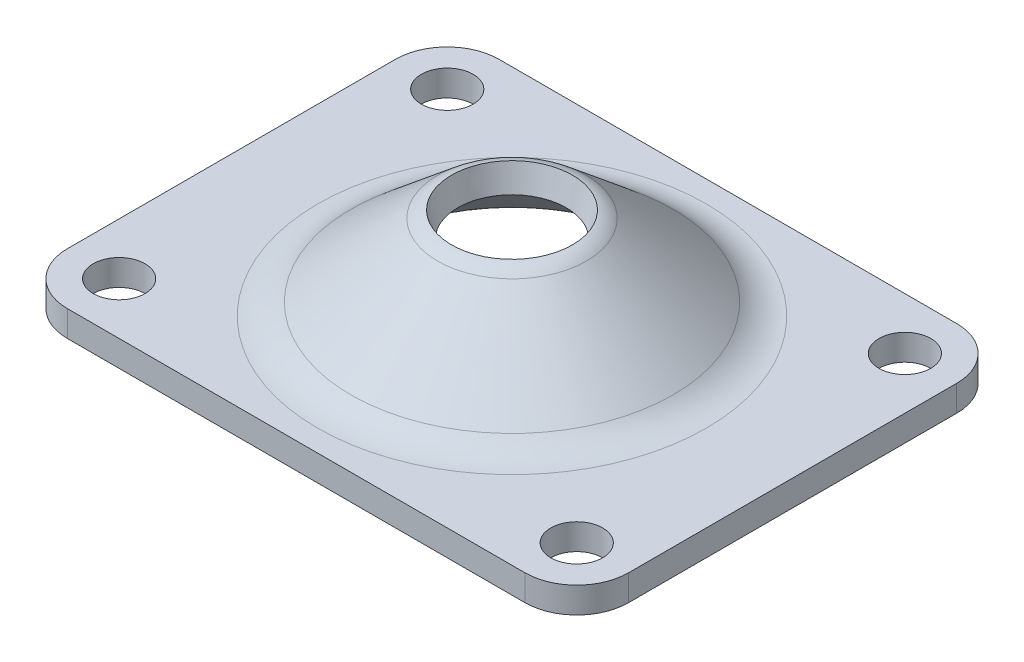
ISO-10303-21;
HEADER;
FILE_DESCRIPTION(('STEP AP214'),'2;1');
FILE_NAME('part.step','',(''),(''),'','','');
FILE_SCHEMA(('AUTOMOTIVE_DESIGN { 1 0 10303 214 1 1 1 1 }'));
ENDSEC;
DATA;
#1=APPLICATION_CONTEXT('core data for automotive mechanical design processes');
#2=APPLICATION_PROTOCOL_DEFINITION('international standard','automotive_design',2000,#1);
#3=PRODUCT_CONTEXT('',#1,'mechanical');
#4=PRODUCT('Part','Part','',(#3));
#5=PRODUCT_RELATED_PRODUCT_CATEGORY('part','',(#4));
#6=PRODUCT_DEFINITION_FORMATION('','',#4);
#7=PRODUCT_DEFINITION_CONTEXT('part definition',#1,'design');
#8=PRODUCT_DEFINITION('design','',#6,#7);
#9=PRODUCT_DEFINITION_SHAPE('','',#8);
#10=(LENGTH_UNIT() NAMED_UNIT(*) SI_UNIT(.MILLI.,.METRE.));
#11=(NAMED_UNIT(*) PLANE_ANGLE_UNIT() SI_UNIT($,.RADIAN.));
#12=(NAMED_UNIT(*) SI_UNIT($,.STERADIAN.) SOLID_ANGLE_UNIT());
#13=UNCERTAINTY_MEASURE_WITH_UNIT(LENGTH_MEASURE(1.E-05),#10,'distance_accuracy_value','');
#14=(GEOMETRIC_REPRESENTATION_CONTEXT(3) GLOBAL_UNCERTAINTY_ASSIGNED_CONTEXT((#13)) GLOBAL_UNIT_ASSIGNED_CONTEXT((#10,
#11,#12)) REPRESENTATION_CONTEXT('',''));
#15=CARTESIAN_POINT('',(0.,0.,0.));
#16=DIRECTION('',(0.,0.,1.));
#17=DIRECTION('',(1.,0.,0.));
#18=AXIS2_PLACEMENT_3D('',#15,#16,#17);
#19=CARTESIAN_POINT('',(-26.5,3.,19.));
#20=DIRECTION('',(0.,1.,0.));
#21=DIRECTION('',(0.,0.,1.));
#22=AXIS2_PLACEMENT_3D('',#19,#20,#21);
#23=PLANE('',#22);
#24=CARTESIAN_POINT('',(-26.5,3.,19.));
#25=DIRECTION('',(0.,1.,0.));
#26=DIRECTION('',(0.,0.,1.));
#27=AXIS2_PLACEMENT_3D('',#24,#25,#26);
#28=CIRCLE('',#27,3.);
#29=CARTESIAN_POINT('',(-26.5,3.,22.));
#30=VERTEX_POINT('',#29);
#31=EDGE_CURVE('E199',#30,#30,#28,.T.);
#32=ORIENTED_EDGE('',*,*,#31,.F.);
#33=EDGE_LOOP('',(#32));
#34=FACE_BOUND('',#33,.T.);
#35=CARTESIAN_POINT('',(26.5,3.,-19.));
#36=DIRECTION('',(0.,1.,0.));
#37=DIRECTION('',(0.,0.,1.));
#38=AXIS2_PLACEMENT_3D('',#35,#36,#37);
#39=CIRCLE('',#38,3.);
#40=CARTESIAN_POINT('',(26.5,3.,-16.));
#41=VERTEX_POINT('',#40);
#42=EDGE_CURVE('E187',#41,#41,#39,.T.);
#43=ORIENTED_EDGE('',*,*,#42,.F.);
#44=EDGE_LOOP('',(#43));
#45=FACE_BOUND('',#44,.T.);
#46=CARTESIAN_POINT('',(-26.5,3.,19.));
#47=DIRECTION('',(0.,1.,0.));
#48=DIRECTION('',(0.,0.,1.));
#49=AXIS2_PLACEMENT_3D('',#46,#47,#48);
#50=CIRCLE('',#49,6.);
#51=CARTESIAN_POINT('',(-32.5,3.,19.));
#52=VERTEX_POINT('',#51);
#53=CARTESIAN_POINT('',(-26.5,3.,25.));
#54=VERTEX_POINT('',#53);
#55=EDGE_CURVE('E151',#52,#54,#50,.T.);
#56=ORIENTED_EDGE('',*,*,#55,.T.);
#57=DIRECTION('',(1.,0.,0.));
#58=VECTOR('',#57,1.);
#59=CARTESIAN_POINT('',(-26.5,3.,25.));
#60=LINE('',#59,#58);
#61=CARTESIAN_POINT('',(26.5,3.,25.));
#62=VERTEX_POINT('',#61);
#63=EDGE_CURVE('E97',#54,#62,#60,.T.);
#64=ORIENTED_EDGE('',*,*,#63,.T.);
#65=CARTESIAN_POINT('',(26.5,3.,19.));
#66=DIRECTION('',(0.,1.,0.));
#67=DIRECTION('',(0.,0.,1.));
#68=AXIS2_PLACEMENT_3D('',#65,#66,#67);
#69=CIRCLE('',#68,6.);
#70=CARTESIAN_POINT('',(32.5,3.,19.));
#71=VERTEX_POINT('',#70);
#72=EDGE_CURVE('E167',#62,#71,#69,.T.);
#73=ORIENTED_EDGE('',*,*,#72,.T.);
#74=DIRECTION('',(0.,0.,-1.));
#75=VECTOR('',#74,1.);
#76=CARTESIAN_POINT('',(32.5,3.,-19.));
#77=LINE('',#76,#75);
#78=CARTESIAN_POINT('',(32.5,3.,-19.));
#79=VERTEX_POINT('',#78);
#80=EDGE_CURVE('E178',#71,#79,#77,.T.);
#81=ORIENTED_EDGE('',*,*,#80,.T.);
#82=CARTESIAN_POINT('',(26.5,3.,-19.));
#83=DIRECTION('',(0.,1.,0.));
#84=DIRECTION('',(0.,0.,-1.));
#85=AXIS2_PLACEMENT_3D('',#82,#83,#84);
#86=CIRCLE('',#85,6.);
#87=CARTESIAN_POINT('',(26.5,3.,-25.));
#88=VERTEX_POINT('',#87);
#89=EDGE_CURVE('E117',#79,#88,#86,.T.);
#90=ORIENTED_EDGE('',*,*,#89,.T.);
#91=DIRECTION('',(-1.,0.,0.));
#92=VECTOR('',#91,1.);
#93=CARTESIAN_POINT('',(-26.5,3.,-25.));
#94=LINE('',#93,#92);
#95=CARTESIAN_POINT('',(-26.5,3.,-25.));
#96=VERTEX_POINT('',#95);
#97=EDGE_CURVE('E115',#88,#96,#94,.T.);
#98=ORIENTED_EDGE('',*,*,#97,.T.);
#99=CARTESIAN_POINT('',(-26.5,3.,-19.));
#100=DIRECTION('',(0.,1.,0.));
#101=DIRECTION('',(0.,0.,1.));
#102=AXIS2_PLACEMENT_3D('',#99,#100,#101);
#103=CIRCLE('',#102,6.);
#104=CARTESIAN_POINT('',(-32.5,3.,-19.));
#105=VERTEX_POINT('',#104);
#106=EDGE_CURVE('E116',#96,#105,#103,.T.);
#107=ORIENTED_EDGE('',*,*,#106,.T.);
#108=DIRECTION('',(0.,0.,1.));
#109=VECTOR('',#108,1.);
#110=CARTESIAN_POINT('',(-32.5,3.,-19.));
#111=LINE('',#110,#109);
#112=EDGE_CURVE('E57',#105,#52,#111,.T.);
#113=ORIENTED_EDGE('',*,*,#112,.T.);
#114=EDGE_LOOP('',(#56,#64,#73,#81,#90,#98,#107,#113));
#115=FACE_BOUND('',#114,.T.);
#116=CARTESIAN_POINT('',(-26.5,3.,-19.));
#117=DIRECTION('',(0.,1.,0.));
#118=DIRECTION('',(0.,0.,1.));
#119=AXIS2_PLACEMENT_3D('',#116,#117,#118);
#120=CIRCLE('',#119,3.);
#121=CARTESIAN_POINT('',(-26.5,3.,-16.));
#122=VERTEX_POINT('',#121);
#123=EDGE_CURVE('E139',#122,#122,#120,.T.);
#124=ORIENTED_EDGE('',*,*,#123,.F.);
#125=EDGE_LOOP('',(#124));
#126=FACE_BOUND('',#125,.T.);
#127=CARTESIAN_POINT('',(26.5,3.,19.));
#128=DIRECTION('',(0.,1.,0.));
#129=DIRECTION('',(0.,0.,1.));
#130=AXIS2_PLACEMENT_3D('',#127,#128,#129);
#131=CIRCLE('',#130,3.);
#132=CARTESIAN_POINT('',(26.5,3.,22.));
#133=VERTEX_POINT('',#132);
#134=EDGE_CURVE('E193',#133,#133,#131,.T.);
#135=ORIENTED_EDGE('',*,*,#134,.F.);
#136=EDGE_LOOP('',(#135));
#137=FACE_BOUND('',#136,.T.);
#138=CARTESIAN_POINT('',(0.,3.,0.));
#139=DIRECTION('',(0.,1.,0.));
#140=DIRECTION('',(0.,0.,1.));
#141=AXIS2_PLACEMENT_3D('',#138,#139,#140);
#142=CIRCLE('',#141,22.5);
#143=CARTESIAN_POINT('',(0.,3.,22.5));
#144=VERTEX_POINT('',#143);
#145=EDGE_CURVE('E206',#144,#144,#142,.T.);
#146=ORIENTED_EDGE('',*,*,#145,.F.);
#147=EDGE_LOOP('',(#146));
#148=FACE_BOUND('',#147,.T.);
#149=ADVANCED_FACE('F39',(#34,#45,#115,#126,#137,#148),#23,.T.);
#150=CARTESIAN_POINT('',(-26.5,0.,19.));
#151=DIRECTION('',(0.,1.,0.));
#152=DIRECTION('',(0.,0.,1.));
#153=AXIS2_PLACEMENT_3D('',#150,#151,#152);
#154=PLANE('',#153);
#155=CARTESIAN_POINT('',(-26.5,0.,19.));
#156=DIRECTION('',(0.,1.,0.));
#157=DIRECTION('',(0.,0.,1.));
#158=AXIS2_PLACEMENT_3D('',#155,#156,#157);
#159=CIRCLE('',#158,6.);
#160=CARTESIAN_POINT('',(-32.5,0.,19.));
#161=VERTEX_POINT('',#160);
#162=CARTESIAN_POINT('',(-26.5,0.,25.));
#163=VERTEX_POINT('',#162);
#164=EDGE_CURVE('E136',#161,#163,#159,.T.);
#165=ORIENTED_EDGE('',*,*,#164,.F.);
#166=DIRECTION('',(0.,0.,1.));
#167=VECTOR('',#166,1.);
#168=CARTESIAN_POINT('',(-32.5,0.,-19.));
#169=LINE('',#168,#167);
#170=CARTESIAN_POINT('',(-32.5,0.,-19.));
#171=VERTEX_POINT('',#170);
#172=EDGE_CURVE('E93',#171,#161,#169,.T.);
#173=ORIENTED_EDGE('',*,*,#172,.F.);
#174=CARTESIAN_POINT('',(-26.5,0.,-19.));
#175=DIRECTION('',(0.,1.,0.));
#176=DIRECTION('',(0.,0.,1.));
#177=AXIS2_PLACEMENT_3D('',#174,#175,#176);
#178=CIRCLE('',#177,6.);
#179=CARTESIAN_POINT('',(-26.5,0.,-25.));
#180=VERTEX_POINT('',#179);
#181=EDGE_CURVE('E84',#180,#171,#178,.T.);
#182=ORIENTED_EDGE('',*,*,#181,.F.);
#183=DIRECTION('',(-1.,0.,0.));
#184=VECTOR('',#183,1.);
#185=CARTESIAN_POINT('',(-26.5,0.,-25.));
#186=LINE('',#185,#184);
#187=CARTESIAN_POINT('',(26.5,0.,-25.));
#188=VERTEX_POINT('',#187);
#189=EDGE_CURVE('E127',#188,#180,#186,.T.);
#190=ORIENTED_EDGE('',*,*,#189,.F.);
#191=CARTESIAN_POINT('',(26.5,0.,-19.));
#192=DIRECTION('',(0.,1.,0.));
#193=DIRECTION('',(0.,0.,-1.));
#194=AXIS2_PLACEMENT_3D('',#191,#192,#193);
#195=CIRCLE('',#194,6.);
#196=CARTESIAN_POINT('',(32.5,0.,-19.));
#197=VERTEX_POINT('',#196);
#198=EDGE_CURVE('E148',#197,#188,#195,.T.);
#199=ORIENTED_EDGE('',*,*,#198,.F.);
#200=DIRECTION('',(0.,0.,-1.));
#201=VECTOR('',#200,1.);
#202=CARTESIAN_POINT('',(32.5,0.,-19.));
#203=LINE('',#202,#201);
#204=CARTESIAN_POINT('',(32.5,0.,19.));
#205=VERTEX_POINT('',#204);
#206=EDGE_CURVE('E145',#205,#197,#203,.T.);
#207=ORIENTED_EDGE('',*,*,#206,.F.);
#208=CARTESIAN_POINT('',(26.5,0.,19.));
#209=DIRECTION('',(0.,1.,0.));
#210=DIRECTION('',(0.,0.,1.));
#211=AXIS2_PLACEMENT_3D('',#208,#209,#210);
#212=CIRCLE('',#211,6.);
#213=CARTESIAN_POINT('',(26.5,0.,25.));
#214=VERTEX_POINT('',#213);
#215=EDGE_CURVE('E142',#214,#205,#212,.T.);
#216=ORIENTED_EDGE('',*,*,#215,.F.);
#217=DIRECTION('',(1.,0.,0.));
#218=VECTOR('',#217,1.);
#219=CARTESIAN_POINT('',(-26.5,0.,25.));
#220=LINE('',#219,#218);
#221=EDGE_CURVE('E138',#163,#214,#220,.T.);
#222=ORIENTED_EDGE('',*,*,#221,.F.);
#223=EDGE_LOOP('',(#165,#173,#182,#190,#199,#207,#216,#222));
#224=FACE_BOUND('',#223,.T.);
#225=CARTESIAN_POINT('',(-26.5,0.,-19.));
#226=DIRECTION('',(0.,1.,0.));
#227=DIRECTION('',(0.,0.,1.));
#228=AXIS2_PLACEMENT_3D('',#225,#226,#227);
#229=CIRCLE('',#228,3.);
#230=CARTESIAN_POINT('',(-26.5,0.,-16.));
#231=VERTEX_POINT('',#230);
#232=EDGE_CURVE('E183',#231,#231,#229,.T.);
#233=ORIENTED_EDGE('',*,*,#232,.T.);
#234=EDGE_LOOP('',(#233));
#235=FACE_BOUND('',#234,.T.);
#236=CARTESIAN_POINT('',(26.5,0.,-19.));
#237=DIRECTION('',(0.,1.,0.));
#238=DIRECTION('',(0.,0.,1.));
#239=AXIS2_PLACEMENT_3D('',#236,#237,#238);
#240=CIRCLE('',#239,3.);
#241=CARTESIAN_POINT('',(26.5,0.,-16.));
#242=VERTEX_POINT('',#241);
#243=EDGE_CURVE('E191',#242,#242,#240,.T.);
#244=ORIENTED_EDGE('',*,*,#243,.T.);
#245=EDGE_LOOP('',(#244));
#246=FACE_BOUND('',#245,.T.);
#247=CARTESIAN_POINT('',(26.5,0.,19.));
#248=DIRECTION('',(0.,1.,0.));
#249=DIRECTION('',(0.,0.,1.));
#250=AXIS2_PLACEMENT_3D('',#247,#248,#249);
#251=CIRCLE('',#250,3.);
#252=CARTESIAN_POINT('',(26.5,0.,22.));
#253=VERTEX_POINT('',#252);
#254=EDGE_CURVE('E197',#253,#253,#251,.T.);
#255=ORIENTED_EDGE('',*,*,#254,.T.);
#256=EDGE_LOOP('',(#255));
#257=FACE_BOUND('',#256,.T.);
#258=CARTESIAN_POINT('',(-26.5,0.,19.));
#259=DIRECTION('',(0.,1.,0.));
#260=DIRECTION('',(0.,0.,1.));
#261=AXIS2_PLACEMENT_3D('',#258,#259,#260);
#262=CIRCLE('',#261,3.);
#263=CARTESIAN_POINT('',(-26.5,0.,22.));
#264=VERTEX_POINT('',#263);
#265=EDGE_CURVE('E201',#264,#264,#262,.T.);
#266=ORIENTED_EDGE('',*,*,#265,.T.);
#267=EDGE_LOOP('',(#266));
#268=FACE_BOUND('',#267,.T.);
#269=CARTESIAN_POINT('',(0.,0.,0.));
#270=DIRECTION('',(0.,-1.,0.));
#271=DIRECTION('',(1.,0.,0.));
#272=AXIS2_PLACEMENT_3D('',#269,#270,#271);
#273=CIRCLE('',#272,22.5);
#274=CARTESIAN_POINT('',(22.5,0.,0.));
#275=VERTEX_POINT('',#274);
#276=EDGE_CURVE('E228',#275,#275,#273,.T.);
#277=ORIENTED_EDGE('',*,*,#276,.F.);
#278=EDGE_LOOP('',(#277));
#279=FACE_BOUND('',#278,.T.);
#280=ADVANCED_FACE('F168',(#224,#235,#246,#257,#268,#279),#154,.F.);
#281=CARTESIAN_POINT('',(-26.5,3.,19.));
#282=DIRECTION('',(0.,-1.,0.));
#283=DIRECTION('',(0.,0.,-1.));
#284=AXIS2_PLACEMENT_3D('',#281,#282,#283);
#285=CYLINDRICAL_SURFACE('',#284,6.);
#286=ORIENTED_EDGE('',*,*,#164,.T.);
#287=DIRECTION('',(0.,-1.,0.));
#288=VECTOR('',#287,1.);
#289=CARTESIAN_POINT('',(-26.5,3.,25.));
#290=LINE('',#289,#288);
#291=EDGE_CURVE('E11',#54,#163,#290,.T.);
#292=ORIENTED_EDGE('',*,*,#291,.F.);
#293=ORIENTED_EDGE('',*,*,#55,.F.);
#294=DIRECTION('',(0.,-1.,0.));
#295=VECTOR('',#294,1.);
#296=CARTESIAN_POINT('',(-32.5,3.,19.));
#297=LINE('',#296,#295);
#298=EDGE_CURVE('E135',#52,#161,#297,.T.);
#299=ORIENTED_EDGE('',*,*,#298,.T.);
#300=EDGE_LOOP('',(#286,#292,#293,#299));
#301=FACE_BOUND('',#300,.T.);
#302=ADVANCED_FACE('F41',(#301),#285,.T.);
#303=CARTESIAN_POINT('',(-26.5,3.,25.));
#304=DIRECTION('',(0.,0.,-1.));
#305=DIRECTION('',(-1.,0.,0.));
#306=AXIS2_PLACEMENT_3D('',#303,#304,#305);
#307=PLANE('',#306);
#308=ORIENTED_EDGE('',*,*,#221,.T.);
#309=DIRECTION('',(0.,-1.,0.));
#310=VECTOR('',#309,1.);
#311=CARTESIAN_POINT('',(26.5,3.,25.));
#312=LINE('',#311,#310);
#313=EDGE_CURVE('E48',#62,#214,#312,.T.);
#314=ORIENTED_EDGE('',*,*,#313,.F.);
#315=ORIENTED_EDGE('',*,*,#63,.F.);
#316=ORIENTED_EDGE('',*,*,#291,.T.);
#317=EDGE_LOOP('',(#308,#314,#315,#316));
#318=FACE_BOUND('',#317,.T.);
#319=ADVANCED_FACE('F241',(#318),#307,.F.);
#320=CARTESIAN_POINT('',(26.5,3.,19.));
#321=DIRECTION('',(0.,-1.,0.));
#322=DIRECTION('',(0.,0.,-1.));
#323=AXIS2_PLACEMENT_3D('',#320,#321,#322);
#324=CYLINDRICAL_SURFACE('',#323,6.);
#325=ORIENTED_EDGE('',*,*,#215,.T.);
#326=DIRECTION('',(0.,-1.,0.));
#327=VECTOR('',#326,1.);
#328=CARTESIAN_POINT('',(32.5,3.,19.));
#329=LINE('',#328,#327);
#330=EDGE_CURVE('E158',#71,#205,#329,.T.);
#331=ORIENTED_EDGE('',*,*,#330,.F.);
#332=ORIENTED_EDGE('',*,*,#72,.F.);
#333=ORIENTED_EDGE('',*,*,#313,.T.);
#334=EDGE_LOOP('',(#325,#331,#332,#333));
#335=FACE_BOUND('',#334,.T.);
#336=ADVANCED_FACE('F163',(#335),#324,.T.);
#337=CARTESIAN_POINT('',(32.5,3.,-19.));
#338=DIRECTION('',(-1.,0.,0.));
#339=DIRECTION('',(0.,0.,1.));
#340=AXIS2_PLACEMENT_3D('',#337,#338,#339);
#341=PLANE('',#340);
#342=ORIENTED_EDGE('',*,*,#206,.T.);
#343=DIRECTION('',(0.,-1.,0.));
#344=VECTOR('',#343,1.);
#345=CARTESIAN_POINT('',(32.5,3.,-19.));
#346=LINE('',#345,#344);
#347=EDGE_CURVE('E154',#79,#197,#346,.T.);
#348=ORIENTED_EDGE('',*,*,#347,.F.);
#349=ORIENTED_EDGE('',*,*,#80,.F.);
#350=ORIENTED_EDGE('',*,*,#330,.T.);
#351=EDGE_LOOP('',(#342,#348,#349,#350));
#352=FACE_BOUND('',#351,.T.);
#353=ADVANCED_FACE('F174',(#352),#341,.F.);
#354=CARTESIAN_POINT('',(26.5,3.,-19.));
#355=DIRECTION('',(0.,-1.,0.));
#356=DIRECTION('',(0.,0.,-1.));
#357=AXIS2_PLACEMENT_3D('',#354,#355,#356);
#358=CYLINDRICAL_SURFACE('',#357,6.);
#359=ORIENTED_EDGE('',*,*,#198,.T.);
#360=DIRECTION('',(0.,-1.,0.));
#361=VECTOR('',#360,1.);
#362=CARTESIAN_POINT('',(26.5,3.,-25.));
#363=LINE('',#362,#361);
#364=EDGE_CURVE('E130',#88,#188,#363,.T.);
#365=ORIENTED_EDGE('',*,*,#364,.F.);
#366=ORIENTED_EDGE('',*,*,#89,.F.);
#367=ORIENTED_EDGE('',*,*,#347,.T.);
#368=EDGE_LOOP('',(#359,#365,#366,#367));
#369=FACE_BOUND('',#368,.T.);
#370=ADVANCED_FACE('F177',(#369),#358,.T.);
#371=CARTESIAN_POINT('',(-26.5,3.,-25.));
#372=DIRECTION('',(0.,0.,1.));
#373=DIRECTION('',(1.,0.,0.));
#374=AXIS2_PLACEMENT_3D('',#371,#372,#373);
#375=PLANE('',#374);
#376=ORIENTED_EDGE('',*,*,#189,.T.);
#377=DIRECTION('',(0.,-1.,0.));
#378=VECTOR('',#377,1.);
#379=CARTESIAN_POINT('',(-26.5,3.,-25.));
#380=LINE('',#379,#378);
#381=EDGE_CURVE('E122',#96,#180,#380,.T.);
#382=ORIENTED_EDGE('',*,*,#381,.F.);
#383=ORIENTED_EDGE('',*,*,#97,.F.);
#384=ORIENTED_EDGE('',*,*,#364,.T.);
#385=EDGE_LOOP('',(#376,#382,#383,#384));
#386=FACE_BOUND('',#385,.T.);
#387=ADVANCED_FACE('F123',(#386),#375,.F.);
#388=CARTESIAN_POINT('',(-26.5,3.,-19.));
#389=DIRECTION('',(0.,-1.,0.));
#390=DIRECTION('',(0.,0.,-1.));
#391=AXIS2_PLACEMENT_3D('',#388,#389,#390);
#392=CYLINDRICAL_SURFACE('',#391,6.);
#393=ORIENTED_EDGE('',*,*,#181,.T.);
#394=DIRECTION('',(0.,-1.,0.));
#395=VECTOR('',#394,1.);
#396=CARTESIAN_POINT('',(-32.5,3.,-19.));
#397=LINE('',#396,#395);
#398=EDGE_CURVE('E126',#105,#171,#397,.T.);
#399=ORIENTED_EDGE('',*,*,#398,.F.);
#400=ORIENTED_EDGE('',*,*,#106,.F.);
#401=ORIENTED_EDGE('',*,*,#381,.T.);
#402=EDGE_LOOP('',(#393,#399,#400,#401));
#403=FACE_BOUND('',#402,.T.);
#404=ADVANCED_FACE('F128',(#403),#392,.T.);
#405=CARTESIAN_POINT('',(-32.5,3.,-19.));
#406=DIRECTION('',(1.,0.,0.));
#407=DIRECTION('',(0.,0.,-1.));
#408=AXIS2_PLACEMENT_3D('',#405,#406,#407);
#409=PLANE('',#408);
#410=ORIENTED_EDGE('',*,*,#172,.T.);
#411=ORIENTED_EDGE('',*,*,#298,.F.);
#412=ORIENTED_EDGE('',*,*,#112,.F.);
#413=ORIENTED_EDGE('',*,*,#398,.T.);
#414=EDGE_LOOP('',(#410,#411,#412,#413));
#415=FACE_BOUND('',#414,.T.);
#416=ADVANCED_FACE('F250',(#415),#409,.F.);
#417=CARTESIAN_POINT('',(-26.5,3.,-19.));
#418=DIRECTION('',(0.,-1.,0.));
#419=DIRECTION('',(0.,0.,-1.));
#420=AXIS2_PLACEMENT_3D('',#417,#418,#419);
#421=CYLINDRICAL_SURFACE('',#420,3.);
#422=ORIENTED_EDGE('',*,*,#123,.T.);
#423=EDGE_LOOP('',(#422));
#424=FACE_BOUND('',#423,.T.);
#425=ORIENTED_EDGE('',*,*,#232,.F.);
#426=EDGE_LOOP('',(#425));
#427=FACE_BOUND('',#426,.T.);
#428=ADVANCED_FACE('F249',(#424,#427),#421,.F.);
#429=CARTESIAN_POINT('',(26.5,3.,-19.));
#430=DIRECTION('',(0.,-1.,0.));
#431=DIRECTION('',(0.,0.,-1.));
#432=AXIS2_PLACEMENT_3D('',#429,#430,#431);
#433=CYLINDRICAL_SURFACE('',#432,3.);
#434=ORIENTED_EDGE('',*,*,#42,.T.);
#435=EDGE_LOOP('',(#434));
#436=FACE_BOUND('',#435,.T.);
#437=ORIENTED_EDGE('',*,*,#243,.F.);
#438=EDGE_LOOP('',(#437));
#439=FACE_BOUND('',#438,.T.);
#440=ADVANCED_FACE('F303',(#436,#439),#433,.F.);
#441=CARTESIAN_POINT('',(26.5,3.,19.));
#442=DIRECTION('',(0.,-1.,0.));
#443=DIRECTION('',(0.,0.,-1.));
#444=AXIS2_PLACEMENT_3D('',#441,#442,#443);
#445=CYLINDRICAL_SURFACE('',#444,3.);
#446=ORIENTED_EDGE('',*,*,#134,.T.);
#447=EDGE_LOOP('',(#446));
#448=FACE_BOUND('',#447,.T.);
#449=ORIENTED_EDGE('',*,*,#254,.F.);
#450=EDGE_LOOP('',(#449));
#451=FACE_BOUND('',#450,.T.);
#452=ADVANCED_FACE('F315',(#448,#451),#445,.F.);
#453=CARTESIAN_POINT('',(-26.5,3.,19.));
#454=DIRECTION('',(0.,-1.,0.));
#455=DIRECTION('',(0.,0.,-1.));
#456=AXIS2_PLACEMENT_3D('',#453,#454,#455);
#457=CYLINDRICAL_SURFACE('',#456,3.);
#458=ORIENTED_EDGE('',*,*,#31,.T.);
#459=EDGE_LOOP('',(#458));
#460=FACE_BOUND('',#459,.T.);
#461=ORIENTED_EDGE('',*,*,#265,.F.);
#462=EDGE_LOOP('',(#461));
#463=FACE_BOUND('',#462,.T.);
#464=ADVANCED_FACE('F321',(#460,#463),#457,.F.);
#465=CARTESIAN_POINT('',(0.,9.,0.));
#466=DIRECTION('',(0.,-1.,0.));
#467=DIRECTION('',(1.,0.,0.));
#468=AXIS2_PLACEMENT_3D('',#465,#466,#467);
#469=TOROIDAL_SURFACE('',#468,22.5,6.);
#470=ORIENTED_EDGE('',*,*,#145,.T.);
#471=EDGE_LOOP('',(#470));
#472=FACE_BOUND('',#471,.T.);
#473=CARTESIAN_POINT('',(0.,4.40373334128613,0.));
#474=DIRECTION('',(0.,-1.,0.));
#475=DIRECTION('',(1.,0.,0.));
#476=AXIS2_PLACEMENT_3D('',#473,#474,#475);
#477=CIRCLE('',#476,18.6432743418808);
#478=CARTESIAN_POINT('',(18.6432743418808,4.40373334128613,0.));
#479=VERTEX_POINT('',#478);
#480=EDGE_CURVE('E211',#479,#479,#477,.T.);
#481=ORIENTED_EDGE('',*,*,#480,.T.);
#482=EDGE_LOOP('',(#481));
#483=FACE_BOUND('',#482,.T.);
#484=ADVANCED_FACE('F329',(#472,#483),#469,.F.);
#485=CARTESIAN_POINT('',(0.,12.8174771633764,0.));
#486=DIRECTION('',(0.,-1.,0.));
#487=DIRECTION('',(1.,0.,0.));
#488=AXIS2_PLACEMENT_3D('',#485,#486,#487);
#489=CONICAL_SURFACE('',#488,8.61616491473728,0.872664625997167);
#490=ORIENTED_EDGE('',*,*,#480,.F.);
#491=EDGE_LOOP('',(#490));
#492=FACE_BOUND('',#491,.T.);
#493=CARTESIAN_POINT('',(0.,12.8174771633764,0.));
#494=DIRECTION('',(0.,-1.,0.));
#495=DIRECTION('',(1.,0.,0.));
#496=AXIS2_PLACEMENT_3D('',#493,#494,#495);
#497=CIRCLE('',#496,8.61616491473728);
#498=CARTESIAN_POINT('',(8.61616491473728,12.8174771633764,0.));
#499=VERTEX_POINT('',#498);
#500=EDGE_CURVE('E212',#499,#499,#497,.T.);
#501=ORIENTED_EDGE('',*,*,#500,.T.);
#502=EDGE_LOOP('',(#501));
#503=FACE_BOUND('',#502,.T.);
#504=ADVANCED_FACE('F338',(#492,#503),#489,.T.);
#505=CARTESIAN_POINT('',(0.,9.75329939090051,0.));
#506=DIRECTION('',(0.,-1.,0.));
#507=DIRECTION('',(1.,0.,0.));
#508=AXIS2_PLACEMENT_3D('',#505,#506,#507);
#509=TOROIDAL_SURFACE('',#508,6.04501447599113,4.);
#510=ORIENTED_EDGE('',*,*,#500,.F.);
#511=EDGE_LOOP('',(#510));
#512=FACE_BOUND('',#511,.T.);
#513=CARTESIAN_POINT('',(0.,13.6376272154969,0.));
#514=DIRECTION('',(0.,-1.,0.));
#515=DIRECTION('',(1.,0.,0.));
#516=AXIS2_PLACEMENT_3D('',#513,#514,#515);
#517=CIRCLE('',#516,7.);
#518=CARTESIAN_POINT('',(7.,13.6376272154969,0.));
#519=VERTEX_POINT('',#518);
#520=EDGE_CURVE('E220',#519,#519,#517,.T.);
#521=ORIENTED_EDGE('',*,*,#520,.T.);
#522=EDGE_LOOP('',(#521));
#523=FACE_BOUND('',#522,.T.);
#524=ADVANCED_FACE('F346',(#512,#523),#509,.T.);
#525=CARTESIAN_POINT('',(0.,10.7243813470496,0.));
#526=DIRECTION('',(0.,1.,0.));
#527=DIRECTION('',(-1.,0.,0.));
#528=AXIS2_PLACEMENT_3D('',#525,#526,#527);
#529=CONICAL_SURFACE('',#528,6.28376085699335,0.24107469498018);
#530=ORIENTED_EDGE('',*,*,#520,.F.);
#531=EDGE_LOOP('',(#530));
#532=FACE_BOUND('',#531,.T.);
#533=CARTESIAN_POINT('',(0.,10.7243813470496,0.));
#534=DIRECTION('',(0.,-1.,0.));
#535=DIRECTION('',(1.,0.,0.));
#536=AXIS2_PLACEMENT_3D('',#533,#534,#535);
#537=CIRCLE('',#536,6.28376085699335);
#538=CARTESIAN_POINT('',(6.28376085699335,10.7243813470496,0.));
#539=VERTEX_POINT('',#538);
#540=EDGE_CURVE('E219',#539,#539,#537,.T.);
#541=ORIENTED_EDGE('',*,*,#540,.T.);
#542=EDGE_LOOP('',(#541));
#543=FACE_BOUND('',#542,.T.);
#544=ADVANCED_FACE('F360',(#532,#543),#529,.F.);
#545=CARTESIAN_POINT('',(0.,9.75329939090051,0.));
#546=DIRECTION('',(0.,-1.,0.));
#547=DIRECTION('',(1.,0.,0.));
#548=AXIS2_PLACEMENT_3D('',#545,#546,#547);
#549=TOROIDAL_SURFACE('',#548,6.04501447599113,1.);
#550=ORIENTED_EDGE('',*,*,#540,.F.);
#551=EDGE_LOOP('',(#550));
#552=FACE_BOUND('',#551,.T.);
#553=CARTESIAN_POINT('',(0.,10.5193438340195,0.));
#554=DIRECTION('',(0.,-1.,0.));
#555=DIRECTION('',(1.,0.,0.));
#556=AXIS2_PLACEMENT_3D('',#553,#554,#555);
#557=CIRCLE('',#556,6.68780208567767);
#558=CARTESIAN_POINT('',(6.68780208567767,10.5193438340195,0.));
#559=VERTEX_POINT('',#558);
#560=EDGE_CURVE('E224',#559,#559,#557,.T.);
#561=ORIENTED_EDGE('',*,*,#560,.T.);
#562=EDGE_LOOP('',(#561));
#563=FACE_BOUND('',#562,.T.);
#564=ADVANCED_FACE('F368',(#552,#563),#549,.F.);
#565=CARTESIAN_POINT('',(0.,2.10560001192919,0.));
#566=DIRECTION('',(0.,-1.,0.));
#567=DIRECTION('',(1.,0.,0.));
#568=AXIS2_PLACEMENT_3D('',#565,#566,#567);
#569=CONICAL_SURFACE('',#568,16.7149115128212,0.872664625997167);
#570=ORIENTED_EDGE('',*,*,#560,.F.);
#571=EDGE_LOOP('',(#570));
#572=FACE_BOUND('',#571,.T.);
#573=CARTESIAN_POINT('',(0.,2.10560001192919,0.));
#574=DIRECTION('',(0.,-1.,0.));
#575=DIRECTION('',(1.,0.,0.));
#576=AXIS2_PLACEMENT_3D('',#573,#574,#575);
#577=CIRCLE('',#576,16.7149115128212);
#578=CARTESIAN_POINT('',(16.7149115128212,2.10560001192919,0.));
#579=VERTEX_POINT('',#578);
#580=EDGE_CURVE('E226',#579,#579,#577,.T.);
#581=ORIENTED_EDGE('',*,*,#580,.T.);
#582=EDGE_LOOP('',(#581));
#583=FACE_BOUND('',#582,.T.);
#584=ADVANCED_FACE('F374',(#572,#583),#569,.F.);
#585=CARTESIAN_POINT('',(0.,9.,0.));
#586=DIRECTION('',(0.,-1.,0.));
#587=DIRECTION('',(1.,0.,0.));
#588=AXIS2_PLACEMENT_3D('',#585,#586,#587);
#589=TOROIDAL_SURFACE('',#588,22.5,9.);
#590=ORIENTED_EDGE('',*,*,#580,.F.);
#591=EDGE_LOOP('',(#590));
#592=FACE_BOUND('',#591,.T.);
#593=ORIENTED_EDGE('',*,*,#276,.T.);
#594=EDGE_LOOP('',(#593));
#595=FACE_BOUND('',#594,.T.);
#596=ADVANCED_FACE('F232',(#592,#595),#589,.T.);
#597=CLOSED_SHELL('',(#149,#280,#302,#319,#336,#353,#370,#387,#404,#416,#428,#440,#452,#464,
#484,#504,#524,#544,#564,#584,#596));
#598=MANIFOLD_SOLID_BREP('B2',#597);
#599=ADVANCED_BREP_SHAPE_REPRESENTATION('',(#18,#598),#14);
#600=SHAPE_DEFINITION_REPRESENTATION(#9,#599);
ENDSEC;
END-ISO-10303-21;
